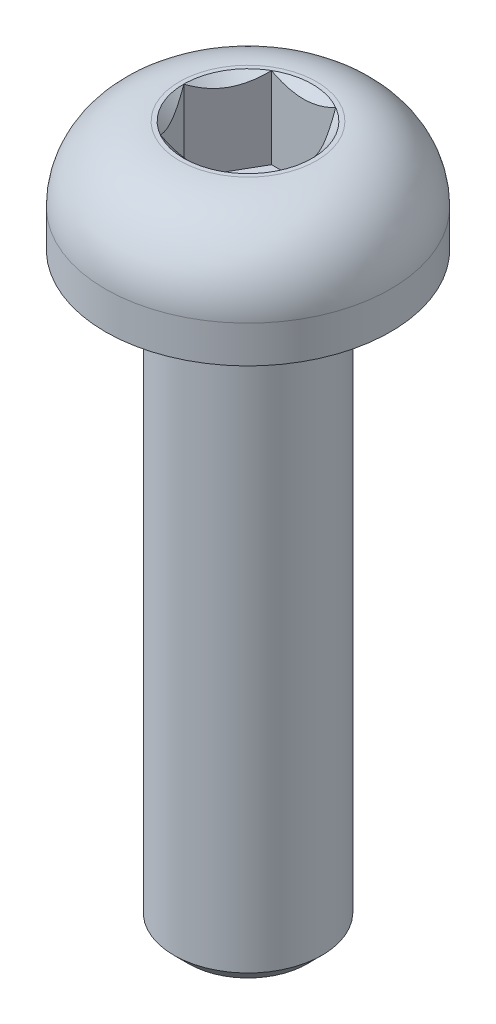
ISO-10303-21;
HEADER;
FILE_DESCRIPTION(('STEP AP214'),'2;1');
FILE_NAME('part.step','',(''),(''),'','','');
FILE_SCHEMA(('AUTOMOTIVE_DESIGN { 1 0 10303 214 1 1 1 1 }'));
ENDSEC;
DATA;
#1=APPLICATION_CONTEXT('core data for automotive mechanical design processes');
#2=APPLICATION_PROTOCOL_DEFINITION('international standard','automotive_design',2000,#1);
#3=PRODUCT_CONTEXT('',#1,'mechanical');
#4=PRODUCT('Part','Part','',(#3));
#5=PRODUCT_RELATED_PRODUCT_CATEGORY('part','',(#4));
#6=PRODUCT_DEFINITION_FORMATION('','',#4);
#7=PRODUCT_DEFINITION_CONTEXT('part definition',#1,'design');
#8=PRODUCT_DEFINITION('design','',#6,#7);
#9=PRODUCT_DEFINITION_SHAPE('','',#8);
#10=(LENGTH_UNIT() NAMED_UNIT(*) SI_UNIT(.MILLI.,.METRE.));
#11=(NAMED_UNIT(*) PLANE_ANGLE_UNIT() SI_UNIT($,.RADIAN.));
#12=(NAMED_UNIT(*) SI_UNIT($,.STERADIAN.) SOLID_ANGLE_UNIT());
#13=UNCERTAINTY_MEASURE_WITH_UNIT(LENGTH_MEASURE(1.E-05),#10,'distance_accuracy_value','');
#14=(GEOMETRIC_REPRESENTATION_CONTEXT(3) GLOBAL_UNCERTAINTY_ASSIGNED_CONTEXT((#13)) GLOBAL_UNIT_ASSIGNED_CONTEXT((#10,
#11,#12)) REPRESENTATION_CONTEXT('',''));
#15=CARTESIAN_POINT('',(0.,0.,0.));
#16=DIRECTION('',(0.,0.,1.));
#17=DIRECTION('',(1.,0.,0.));
#18=AXIS2_PLACEMENT_3D('',#15,#16,#17);
#19=CARTESIAN_POINT('',(0.,1.5,0.));
#20=DIRECTION('',(0.,1.,0.));
#21=DIRECTION('',(0.,0.,1.));
#22=AXIS2_PLACEMENT_3D('',#19,#20,#21);
#23=CONICAL_SURFACE('',#22,0.8675,0.785398163397447);
#24=CARTESIAN_POINT('',(-0.904257203356344,1.80731108686539,0.75));
#25=CARTESIAN_POINT('',(-0.882412754882664,1.79049979910954,0.75));
#26=CARTESIAN_POINT('',(-0.860451107500837,1.77384125033269,0.75));
#27=CARTESIAN_POINT('',(-0.816244486084032,1.74089387022514,0.75));
#28=CARTESIAN_POINT('',(-0.793999446840781,1.72460512647585,0.75));
#29=CARTESIAN_POINT('',(-0.72644041609512,1.67615733343807,0.75));
#30=CARTESIAN_POINT('',(-0.680633506413183,1.64467463278481,0.75));
#31=CARTESIAN_POINT('',(-0.584305204334506,1.58248336485275,0.75));
#32=CARTESIAN_POINT('',(-0.533669074640383,1.55195058649996,0.75));
#33=CARTESIAN_POINT('',(-0.42982179281195,1.49583225025063,0.75));
#34=CARTESIAN_POINT('',(-0.376620129723797,1.47022998377489,0.75));
#35=CARTESIAN_POINT('',(-0.297133733137049,1.43889962113901,0.75));
#36=CARTESIAN_POINT('',(-0.272118020151624,1.42998013178715,0.75));
#37=CARTESIAN_POINT('',(-0.221461613995012,1.41414014673559,0.75));
#38=CARTESIAN_POINT('',(-0.195820881172346,1.40721977822058,0.75));
#39=CARTESIAN_POINT('',(-0.11907719555794,1.39029491353452,0.75));
#40=CARTESIAN_POINT('',(-0.0671369524161806,1.38369713453022,0.75));
#41=CARTESIAN_POINT('',(0.0346954769499289,1.38165186600552,0.75));
#42=CARTESIAN_POINT('',(0.0845776810804191,1.38572847067954,0.75));
#43=CARTESIAN_POINT('',(0.158553806983134,1.39867277619897,0.75));
#44=CARTESIAN_POINT('',(0.183299969448745,1.40421127142444,0.75));
#45=CARTESIAN_POINT('',(0.2322573109883,1.41728731594566,0.75));
#46=CARTESIAN_POINT('',(0.256468520143736,1.42482475252543,0.75));
#47=CARTESIAN_POINT('',(0.330945548164446,1.45089644122846,0.75));
#48=CARTESIAN_POINT('',(0.380191097628157,1.47232740617748,0.75));
#49=CARTESIAN_POINT('',(0.476384677382066,1.52001795957995,0.75));
#50=CARTESIAN_POINT('',(0.523323854348435,1.54629455464135,0.75));
#51=CARTESIAN_POINT('',(0.613051165606588,1.6005514563587,0.75));
#52=CARTESIAN_POINT('',(0.655929862931857,1.62838392150654,0.75));
#53=CARTESIAN_POINT('',(0.719102713352825,1.67143006191857,0.75));
#54=CARTESIAN_POINT('',(0.739888629425195,1.68593448465665,0.75));
#55=CARTESIAN_POINT('',(0.781175323237965,1.71533224663196,0.75));
#56=CARTESIAN_POINT('',(0.801676177588826,1.73022547815469,0.75));
#57=CARTESIAN_POINT('',(0.822058112601665,1.74528009529925,0.75));
#58=B_SPLINE_CURVE_WITH_KNOTS('',3,(#24,#25,#26,#27,#28,#29,#30,#31,#32,#33,#34,#35,#36,#37,#38,
#39,#40,#41,#42,#43,#44,#45,#46,#47,#48,#49,#50,#51,#52,#53,#54,#55,#56,#57),.UNSPECIFIED.,.F.,
.F.,(4,2,2,2,2,2,2,2,2,2,2,2,2,2,2,2,4),(0.,0.0826914229952003,0.165402229814626,
0.332081999269817,0.509334939536265,0.685976204286452,0.765577633128521,0.845184125124187,
1.00113218157557,1.15024704962126,1.22624853107426,1.30224572787936,1.46290132447987,
1.62413188955184,1.7774144062988,1.85345016985303,1.92946508764175),.UNSPECIFIED.);
#59=CARTESIAN_POINT('',(0.433012701892219,1.49852540378444,0.75));
#60=VERTEX_POINT('',#59);
#61=CARTESIAN_POINT('',(-0.433012701892219,1.49852540378444,0.75));
#62=VERTEX_POINT('',#61);
#63=EDGE_CURVE('E151',#60,#62,#58,.F.);
#64=ORIENTED_EDGE('',*,*,#63,.T.);
#65=CARTESIAN_POINT('',(-0.432897231838381,1.49864089692921,0.7502));
#66=CARTESIAN_POINT('',(-0.447787073663449,1.48375951424836,0.724410037442318));
#67=CARTESIAN_POINT('',(-0.462925913388238,1.46975166939139,0.698188797871341));
#68=CARTESIAN_POINT('',(-0.493795969782309,1.4441029284667,0.644720291764294));
#69=CARTESIAN_POINT('',(-0.509530126716838,1.4324763154901,0.617467932539428));
#70=CARTESIAN_POINT('',(-0.541257419404004,1.41255944955668,0.562514649618648));
#71=CARTESIAN_POINT('',(-0.55724246221751,1.40421909786581,0.534827743304492));
#72=CARTESIAN_POINT('',(-0.589564457733289,1.39136814574586,0.478844404869148));
#73=CARTESIAN_POINT('',(-0.605900421776115,1.38684794437327,0.450549685156356));
#74=CARTESIAN_POINT('',(-0.634052006136182,1.38277123688187,0.401789710731158));
#75=CARTESIAN_POINT('',(-0.645830977225007,1.38216820039852,0.381387934344429));
#76=CARTESIAN_POINT('',(-0.66936612345897,1.38317990979996,0.340623865303642));
#77=CARTESIAN_POINT('',(-0.681122293004409,1.38479514477447,0.320261582348547));
#78=CARTESIAN_POINT('',(-0.716222952390205,1.39286155075748,0.259465456913179));
#79=CARTESIAN_POINT('',(-0.739392776123958,1.40253433961216,0.219334145003904));
#80=CARTESIAN_POINT('',(-0.780063953349298,1.42588172175675,0.148889599645977));
#81=CARTESIAN_POINT('',(-0.797755796753171,1.43833396185669,0.118246427990916));
#82=CARTESIAN_POINT('',(-0.832446334428588,1.4663850140153,0.058160654195211));
#83=CARTESIAN_POINT('',(-0.849447072771901,1.48197358968819,0.0287145116184093));
#84=CARTESIAN_POINT('',(-0.866140873838277,1.49864089692921,-0.000200000000000535));
#85=B_SPLINE_CURVE_WITH_KNOTS('',3,(#65,#66,#67,#68,#69,#70,#71,#72,#73,#74,#75,#76,#77,#78,#79,
#80,#81,#82,#83,#84),.UNSPECIFIED.,.F.,.F.,(4,2,2,2,2,2,2,2,2,4),(0.,0.099941946609559,
0.200466857654445,0.299393763705716,0.398071297300228,0.468665775681745,0.539275821398836,
0.680536257244562,0.792918418368072,0.904939568716033),.UNSPECIFIED.);
#86=CARTESIAN_POINT('',(-0.866025403784439,1.49852540378444,0.));
#87=VERTEX_POINT('',#86);
#88=EDGE_CURVE('E11',#62,#87,#85,.T.);
#89=ORIENTED_EDGE('',*,*,#88,.T.);
#90=CARTESIAN_POINT('',(-0.866140873838277,1.49864089692921,0.000199999999999512));
#91=CARTESIAN_POINT('',(-0.851251032013209,1.48375951424836,-0.0255899625576818));
#92=CARTESIAN_POINT('',(-0.836112192288419,1.4697516693914,-0.0518112021286593));
#93=CARTESIAN_POINT('',(-0.805242135894349,1.4441029284667,-0.105279708235706));
#94=CARTESIAN_POINT('',(-0.78950797895982,1.43247631549011,-0.132532067460572));
#95=CARTESIAN_POINT('',(-0.757780686272654,1.41255944955668,-0.187485350381352));
#96=CARTESIAN_POINT('',(-0.741795643459148,1.40421909786581,-0.215172256695509));
#97=CARTESIAN_POINT('',(-0.709473647943368,1.39136814574586,-0.271155595130852));
#98=CARTESIAN_POINT('',(-0.693137683900543,1.38684794437328,-0.299450314843644));
#99=CARTESIAN_POINT('',(-0.664986099540476,1.38277123688187,-0.348210289268842));
#100=CARTESIAN_POINT('',(-0.653207128451651,1.38216820039852,-0.368612065655571));
#101=CARTESIAN_POINT('',(-0.629671982217688,1.38317990979996,-0.409376134696358));
#102=CARTESIAN_POINT('',(-0.617915812672249,1.38479514477447,-0.429738417651453));
#103=CARTESIAN_POINT('',(-0.582815153286453,1.39286155075748,-0.490534543086821));
#104=CARTESIAN_POINT('',(-0.5596453295527,1.40253433961216,-0.530665854996096));
#105=CARTESIAN_POINT('',(-0.51897415232736,1.42588172175675,-0.601110400354023));
#106=CARTESIAN_POINT('',(-0.501282308923486,1.43833396185669,-0.631753572009084));
#107=CARTESIAN_POINT('',(-0.466591771248069,1.4663850140153,-0.691839345804789));
#108=CARTESIAN_POINT('',(-0.449591032904757,1.48197358968819,-0.721285488381591));
#109=CARTESIAN_POINT('',(-0.432897231838381,1.49864089692921,-0.7502));
#110=B_SPLINE_CURVE_WITH_KNOTS('',3,(#90,#91,#92,#93,#94,#95,#96,#97,#98,#99,#100,#101,#102,
#103,#104,#105,#106,#107,#108,#109),.UNSPECIFIED.,.F.,.F.,(4,2,2,2,2,2,2,2,2,4),(0.,
0.0999419466095591,0.200466857654445,0.299393763705716,0.398071297300228,0.468665775681745,
0.539275821398836,0.680536257244562,0.792918418368072,0.904939568716032),.UNSPECIFIED.);
#111=CARTESIAN_POINT('',(-0.433012701892219,1.49852540378444,-0.75));
#112=VERTEX_POINT('',#111);
#113=EDGE_CURVE('E44',#87,#112,#110,.T.);
#114=ORIENTED_EDGE('',*,*,#113,.T.);
#115=CARTESIAN_POINT('',(-0.904257203356344,1.80731108686539,-0.75));
#116=CARTESIAN_POINT('',(-0.882412754882664,1.79049979910954,-0.75));
#117=CARTESIAN_POINT('',(-0.860451107500837,1.77384125033269,-0.75));
#118=CARTESIAN_POINT('',(-0.816244486084032,1.74089387022514,-0.75));
#119=CARTESIAN_POINT('',(-0.793999446840781,1.72460512647585,-0.75));
#120=CARTESIAN_POINT('',(-0.72644041609512,1.67615733343807,-0.75));
#121=CARTESIAN_POINT('',(-0.680633506413183,1.64467463278481,-0.75));
#122=CARTESIAN_POINT('',(-0.584305204334507,1.58248336485275,-0.75));
#123=CARTESIAN_POINT('',(-0.533669074640383,1.55195058649996,-0.75));
#124=CARTESIAN_POINT('',(-0.42982179281195,1.49583225025063,-0.75));
#125=CARTESIAN_POINT('',(-0.376620129723798,1.47022998377489,-0.75));
#126=CARTESIAN_POINT('',(-0.297133733137049,1.43889962113901,-0.75));
#127=CARTESIAN_POINT('',(-0.272118020151624,1.42998013178715,-0.75));
#128=CARTESIAN_POINT('',(-0.221461613995012,1.41414014673559,-0.75));
#129=CARTESIAN_POINT('',(-0.195820881172346,1.40721977822059,-0.75));
#130=CARTESIAN_POINT('',(-0.11907719555794,1.39029491353453,-0.75));
#131=CARTESIAN_POINT('',(-0.0671369524161803,1.38369713453023,-0.75));
#132=CARTESIAN_POINT('',(0.0346954769499294,1.38165186600552,-0.75));
#133=CARTESIAN_POINT('',(0.0845776810804197,1.38572847067954,-0.75));
#134=CARTESIAN_POINT('',(0.158553806983135,1.39867277619897,-0.75));
#135=CARTESIAN_POINT('',(0.183299969448746,1.40421127142444,-0.75));
#136=CARTESIAN_POINT('',(0.2322573109883,1.41728731594566,-0.75));
#137=CARTESIAN_POINT('',(0.256468520143736,1.42482475252543,-0.75));
#138=CARTESIAN_POINT('',(0.330945548164446,1.45089644122846,-0.75));
#139=CARTESIAN_POINT('',(0.380191097628158,1.47232740617748,-0.75));
#140=CARTESIAN_POINT('',(0.476384677382067,1.52001795957995,-0.75));
#141=CARTESIAN_POINT('',(0.523323854348436,1.54629455464135,-0.75));
#142=CARTESIAN_POINT('',(0.613051165606589,1.6005514563587,-0.75));
#143=CARTESIAN_POINT('',(0.655929862931858,1.62838392150654,-0.75));
#144=CARTESIAN_POINT('',(0.719102713352826,1.67143006191857,-0.75));
#145=CARTESIAN_POINT('',(0.739888629425196,1.68593448465665,-0.75));
#146=CARTESIAN_POINT('',(0.781175323237966,1.71533224663196,-0.75));
#147=CARTESIAN_POINT('',(0.801676177588827,1.73022547815469,-0.75));
#148=CARTESIAN_POINT('',(0.822058112601667,1.74528009529925,-0.75));
#149=B_SPLINE_CURVE_WITH_KNOTS('',3,(#115,#116,#117,#118,#119,#120,#121,#122,#123,#124,#125,
#126,#127,#128,#129,#130,#131,#132,#133,#134,#135,#136,#137,#138,#139,#140,#141,#142,#143,#144,
#145,#146,#147,#148),.UNSPECIFIED.,.F.,.F.,(4,2,2,2,2,2,2,2,2,2,2,2,2,2,2,2,4),(0.,
0.0826914229952003,0.165402229814626,0.332081999269816,0.509334939536264,0.685976204286451,
0.76557763312852,0.845184125124187,1.00113218157557,1.15024704962126,1.22624853107426,
1.30224572787936,1.46290132447987,1.62413188955185,1.7774144062988,1.85345016985303,
1.92946508764176),.UNSPECIFIED.);
#150=CARTESIAN_POINT('',(0.433012701892219,1.49852540378444,-0.75));
#151=VERTEX_POINT('',#150);
#152=EDGE_CURVE('E182',#112,#151,#149,.T.);
#153=ORIENTED_EDGE('',*,*,#152,.T.);
#154=CARTESIAN_POINT('',(0.432897231838381,1.49864089692921,-0.7502));
#155=CARTESIAN_POINT('',(0.447787073663449,1.48375951424836,-0.724410037442319));
#156=CARTESIAN_POINT('',(0.462925913388238,1.4697516693914,-0.698188797871341));
#157=CARTESIAN_POINT('',(0.493795969782309,1.4441029284667,-0.644720291764295));
#158=CARTESIAN_POINT('',(0.509530126716838,1.43247631549011,-0.617467932539429));
#159=CARTESIAN_POINT('',(0.541257419404004,1.41255944955668,-0.562514649618649));
#160=CARTESIAN_POINT('',(0.55724246221751,1.40421909786581,-0.534827743304492));
#161=CARTESIAN_POINT('',(0.589564457733289,1.39136814574586,-0.478844404869149));
#162=CARTESIAN_POINT('',(0.605900421776115,1.38684794437327,-0.450549685156357));
#163=CARTESIAN_POINT('',(0.634052006136182,1.38277123688187,-0.401789710731159));
#164=CARTESIAN_POINT('',(0.645830977225007,1.38216820039852,-0.38138793434443));
#165=CARTESIAN_POINT('',(0.66936612345897,1.38317990979996,-0.340623865303643));
#166=CARTESIAN_POINT('',(0.681122293004409,1.38479514477447,-0.320261582348548));
#167=CARTESIAN_POINT('',(0.716222952390205,1.39286155075748,-0.25946545691318));
#168=CARTESIAN_POINT('',(0.739392776123958,1.40253433961216,-0.219334145003905));
#169=CARTESIAN_POINT('',(0.780063953349298,1.42588172175675,-0.148889599645978));
#170=CARTESIAN_POINT('',(0.797755796753172,1.43833396185669,-0.118246427990917));
#171=CARTESIAN_POINT('',(0.832446334428589,1.4663850140153,-0.058160654195212));
#172=CARTESIAN_POINT('',(0.849447072771901,1.48197358968819,-0.0287145116184104));
#173=CARTESIAN_POINT('',(0.866140873838277,1.49864089692921,0.000199999999999531));
#174=B_SPLINE_CURVE_WITH_KNOTS('',3,(#154,#155,#156,#157,#158,#159,#160,#161,#162,#163,#164,
#165,#166,#167,#168,#169,#170,#171,#172,#173),.UNSPECIFIED.,.F.,.F.,(4,2,2,2,2,2,2,2,2,4),(0.,
0.0999419466095591,0.200466857654445,0.299393763705716,0.398071297300228,0.468665775681745,
0.539275821398836,0.680536257244562,0.792918418368072,0.904939568716032),.UNSPECIFIED.);
#175=CARTESIAN_POINT('',(0.866025403784439,1.49852540378444,0.));
#176=VERTEX_POINT('',#175);
#177=EDGE_CURVE('E176',#151,#176,#174,.T.);
#178=ORIENTED_EDGE('',*,*,#177,.T.);
#179=CARTESIAN_POINT('',(0.866140873838277,1.49864089692921,-0.000200000000000354));
#180=CARTESIAN_POINT('',(0.851251032013209,1.48375951424836,0.025589962557681));
#181=CARTESIAN_POINT('',(0.836112192288419,1.4697516693914,0.0518112021286585));
#182=CARTESIAN_POINT('',(0.805242135894349,1.4441029284667,0.105279708235705));
#183=CARTESIAN_POINT('',(0.78950797895982,1.4324763154901,0.132532067460572));
#184=CARTESIAN_POINT('',(0.757780686272654,1.41255944955668,0.187485350381352));
#185=CARTESIAN_POINT('',(0.741795643459148,1.40421909786581,0.215172256695508));
#186=CARTESIAN_POINT('',(0.709473647943368,1.39136814574586,0.271155595130852));
#187=CARTESIAN_POINT('',(0.693137683900543,1.38684794437327,0.299450314843644));
#188=CARTESIAN_POINT('',(0.664986099540475,1.38277123688187,0.348210289268842));
#189=CARTESIAN_POINT('',(0.653207128451651,1.38216820039852,0.368612065655571));
#190=CARTESIAN_POINT('',(0.629671982217688,1.38317990979996,0.409376134696358));
#191=CARTESIAN_POINT('',(0.617915812672248,1.38479514477447,0.429738417651453));
#192=CARTESIAN_POINT('',(0.582815153286452,1.39286155075748,0.490534543086821));
#193=CARTESIAN_POINT('',(0.5596453295527,1.40253433961216,0.530665854996096));
#194=CARTESIAN_POINT('',(0.51897415232736,1.42588172175675,0.601110400354023));
#195=CARTESIAN_POINT('',(0.501282308923486,1.43833396185669,0.631753572009084));
#196=CARTESIAN_POINT('',(0.466591771248069,1.4663850140153,0.691839345804788));
#197=CARTESIAN_POINT('',(0.449591032904757,1.48197358968819,0.72128548838159));
#198=CARTESIAN_POINT('',(0.432897231838381,1.49864089692921,0.7502));
#199=B_SPLINE_CURVE_WITH_KNOTS('',3,(#179,#180,#181,#182,#183,#184,#185,#186,#187,#188,#189,
#190,#191,#192,#193,#194,#195,#196,#197,#198),.UNSPECIFIED.,.F.,.F.,(4,2,2,2,2,2,2,2,2,4),(0.,
0.0999419466095594,0.200466857654446,0.299393763705717,0.398071297300229,0.468665775681746,
0.539275821398837,0.680536257244563,0.792918418368072,0.904939568716032),.UNSPECIFIED.);
#200=EDGE_CURVE('E157',#176,#60,#199,.T.);
#201=ORIENTED_EDGE('',*,*,#200,.T.);
#202=EDGE_LOOP('',(#64,#89,#114,#153,#178,#201));
#203=FACE_BOUND('',#202,.T.);
#204=CARTESIAN_POINT('',(0.,1.5,0.));
#205=DIRECTION('',(0.,1.,0.));
#206=DIRECTION('',(0.,0.,1.));
#207=AXIS2_PLACEMENT_3D('',#204,#205,#206);
#208=CIRCLE('',#207,0.8675);
#209=CARTESIAN_POINT('',(0.,1.5,0.8675));
#210=VERTEX_POINT('',#209);
#211=EDGE_CURVE('E148',#210,#210,#208,.T.);
#212=ORIENTED_EDGE('',*,*,#211,.T.);
#213=EDGE_LOOP('',(#212));
#214=FACE_BOUND('',#213,.T.);
#215=ADVANCED_FACE('F35',(#203,#214),#23,.F.);
#216=CARTESIAN_POINT('',(0.,1.5,-0.925));
#217=DIRECTION('',(0.,-1.,0.));
#218=DIRECTION('',(0.,0.,-1.));
#219=AXIS2_PLACEMENT_3D('',#216,#217,#218);
#220=PLANE('',#219);
#221=ORIENTED_EDGE('',*,*,#211,.F.);
#222=EDGE_LOOP('',(#221));
#223=FACE_BOUND('',#222,.T.);
#224=CARTESIAN_POINT('',(0.,1.5,0.));
#225=DIRECTION('',(0.,1.,0.));
#226=DIRECTION('',(0.,0.,1.));
#227=AXIS2_PLACEMENT_3D('',#224,#225,#226);
#228=CIRCLE('',#227,0.925000000000001);
#229=CARTESIAN_POINT('',(0.,1.5,0.925000000000001));
#230=VERTEX_POINT('',#229);
#231=EDGE_CURVE('E145',#230,#230,#228,.T.);
#232=ORIENTED_EDGE('',*,*,#231,.T.);
#233=EDGE_LOOP('',(#232));
#234=FACE_BOUND('',#233,.T.);
#235=ADVANCED_FACE('F168',(#223,#234),#220,.F.);
#236=CARTESIAN_POINT('',(0.,0.5,0.));
#237=DIRECTION('',(0.,1.,0.));
#238=DIRECTION('',(0.,0.,1.));
#239=AXIS2_PLACEMENT_3D('',#236,#237,#238);
#240=DEGENERATE_TOROIDAL_SURFACE('',#239,0.925,1.,.T.);
#241=ORIENTED_EDGE('',*,*,#231,.F.);
#242=EDGE_LOOP('',(#241));
#243=FACE_BOUND('',#242,.T.);
#244=CARTESIAN_POINT('',(0.,0.5,0.));
#245=DIRECTION('',(0.,1.,0.));
#246=DIRECTION('',(0.,0.,1.));
#247=AXIS2_PLACEMENT_3D('',#244,#245,#246);
#248=CIRCLE('',#247,1.925);
#249=CARTESIAN_POINT('',(0.,0.5,1.925));
#250=VERTEX_POINT('',#249);
#251=EDGE_CURVE('E142',#250,#250,#248,.T.);
#252=ORIENTED_EDGE('',*,*,#251,.T.);
#253=EDGE_LOOP('',(#252));
#254=FACE_BOUND('',#253,.T.);
#255=ADVANCED_FACE('F230',(#243,#254),#240,.T.);
#256=CARTESIAN_POINT('',(0.,2.83766527063465,0.));
#257=DIRECTION('',(0.,1.,0.));
#258=DIRECTION('',(0.,0.,1.));
#259=AXIS2_PLACEMENT_3D('',#256,#257,#258);
#260=CYLINDRICAL_SURFACE('',#259,1.925);
#261=ORIENTED_EDGE('',*,*,#251,.F.);
#262=EDGE_LOOP('',(#261));
#263=FACE_BOUND('',#262,.T.);
#264=CARTESIAN_POINT('',(0.,0.,0.));
#265=DIRECTION('',(0.,1.,0.));
#266=DIRECTION('',(0.,0.,1.));
#267=AXIS2_PLACEMENT_3D('',#264,#265,#266);
#268=CIRCLE('',#267,1.925);
#269=CARTESIAN_POINT('',(0.,0.,1.925));
#270=VERTEX_POINT('',#269);
#271=EDGE_CURVE('E139',#270,#270,#268,.T.);
#272=ORIENTED_EDGE('',*,*,#271,.T.);
#273=EDGE_LOOP('',(#272));
#274=FACE_BOUND('',#273,.T.);
#275=ADVANCED_FACE('F235',(#263,#274),#260,.T.);
#276=CARTESIAN_POINT('',(0.,0.,-1.15));
#277=DIRECTION('',(0.,1.,0.));
#278=DIRECTION('',(0.,0.,1.));
#279=AXIS2_PLACEMENT_3D('',#276,#277,#278);
#280=PLANE('',#279);
#281=ORIENTED_EDGE('',*,*,#271,.F.);
#282=EDGE_LOOP('',(#281));
#283=FACE_BOUND('',#282,.T.);
#284=CARTESIAN_POINT('',(0.,0.,0.));
#285=DIRECTION('',(0.,1.,0.));
#286=DIRECTION('',(0.,0.,1.));
#287=AXIS2_PLACEMENT_3D('',#284,#285,#286);
#288=CIRCLE('',#287,1.15);
#289=CARTESIAN_POINT('',(0.,0.,1.15));
#290=VERTEX_POINT('',#289);
#291=EDGE_CURVE('E136',#290,#290,#288,.T.);
#292=ORIENTED_EDGE('',*,*,#291,.T.);
#293=EDGE_LOOP('',(#292));
#294=FACE_BOUND('',#293,.T.);
#295=ADVANCED_FACE('F240',(#283,#294),#280,.F.);
#296=CARTESIAN_POINT('',(0.,-0.15,0.));
#297=DIRECTION('',(0.,1.,0.));
#298=DIRECTION('',(0.,0.,1.));
#299=AXIS2_PLACEMENT_3D('',#296,#297,#298);
#300=TOROIDAL_SURFACE('',#299,1.15,0.15);
#301=ORIENTED_EDGE('',*,*,#291,.F.);
#302=EDGE_LOOP('',(#301));
#303=FACE_BOUND('',#302,.T.);
#304=CARTESIAN_POINT('',(0.,-0.15,0.));
#305=DIRECTION('',(0.,1.,0.));
#306=DIRECTION('',(0.,0.,1.));
#307=AXIS2_PLACEMENT_3D('',#304,#305,#306);
#308=CIRCLE('',#307,1.);
#309=CARTESIAN_POINT('',(0.,-0.15,1.));
#310=VERTEX_POINT('',#309);
#311=EDGE_CURVE('E133',#310,#310,#308,.T.);
#312=ORIENTED_EDGE('',*,*,#311,.T.);
#313=EDGE_LOOP('',(#312));
#314=FACE_BOUND('',#313,.T.);
#315=ADVANCED_FACE('F246',(#303,#314),#300,.F.);
#316=CARTESIAN_POINT('',(0.,2.83766527063465,0.));
#317=DIRECTION('',(0.,1.,0.));
#318=DIRECTION('',(0.,0.,1.));
#319=AXIS2_PLACEMENT_3D('',#316,#317,#318);
#320=CYLINDRICAL_SURFACE('',#319,1.);
#321=ORIENTED_EDGE('',*,*,#311,.F.);
#322=EDGE_LOOP('',(#321));
#323=FACE_BOUND('',#322,.T.);
#324=CARTESIAN_POINT('',(0.,-7.75,0.));
#325=DIRECTION('',(0.,1.,0.));
#326=DIRECTION('',(0.,0.,1.));
#327=AXIS2_PLACEMENT_3D('',#324,#325,#326);
#328=CIRCLE('',#327,1.);
#329=CARTESIAN_POINT('',(0.,-7.75,1.));
#330=VERTEX_POINT('',#329);
#331=EDGE_CURVE('E130',#330,#330,#328,.T.);
#332=ORIENTED_EDGE('',*,*,#331,.T.);
#333=EDGE_LOOP('',(#332));
#334=FACE_BOUND('',#333,.T.);
#335=ADVANCED_FACE('F252',(#323,#334),#320,.T.);
#336=CARTESIAN_POINT('',(0.,-7.95,0.));
#337=DIRECTION('',(0.,1.,0.));
#338=DIRECTION('',(0.,0.,1.));
#339=AXIS2_PLACEMENT_3D('',#336,#337,#338);
#340=CONICAL_SURFACE('',#339,0.800000000000001,0.785398163397453);
#341=ORIENTED_EDGE('',*,*,#331,.F.);
#342=EDGE_LOOP('',(#341));
#343=FACE_BOUND('',#342,.T.);
#344=CARTESIAN_POINT('',(0.,-7.95,0.));
#345=DIRECTION('',(0.,1.,0.));
#346=DIRECTION('',(0.,0.,1.));
#347=AXIS2_PLACEMENT_3D('',#344,#345,#346);
#348=CIRCLE('',#347,0.800000000000001);
#349=CARTESIAN_POINT('',(0.,-7.95,0.800000000000001));
#350=VERTEX_POINT('',#349);
#351=EDGE_CURVE('E127',#350,#350,#348,.T.);
#352=ORIENTED_EDGE('',*,*,#351,.T.);
#353=EDGE_LOOP('',(#352));
#354=FACE_BOUND('',#353,.T.);
#355=ADVANCED_FACE('F258',(#343,#354),#340,.T.);
#356=CARTESIAN_POINT('',(0.,-7.95,0.));
#357=DIRECTION('',(0.,1.,0.));
#358=DIRECTION('',(0.,0.,1.));
#359=AXIS2_PLACEMENT_3D('',#356,#357,#358);
#360=PLANE('',#359);
#361=ORIENTED_EDGE('',*,*,#351,.F.);
#362=EDGE_LOOP('',(#361));
#363=FACE_BOUND('',#362,.T.);
#364=ADVANCED_FACE('F264',(#363),#360,.F.);
#365=CARTESIAN_POINT('',(0.,0.4,0.));
#366=DIRECTION('',(0.,1.,0.));
#367=DIRECTION('',(0.,0.,1.));
#368=AXIS2_PLACEMENT_3D('',#365,#366,#367);
#369=PLANE('',#368);
#370=DIRECTION('',(0.5,0.,0.866025403784439));
#371=VECTOR('',#370,1.);
#372=CARTESIAN_POINT('',(-0.649519052838329,0.4,0.375));
#373=LINE('',#372,#371);
#374=CARTESIAN_POINT('',(-0.866025403784439,0.4,0.));
#375=VERTEX_POINT('',#374);
#376=CARTESIAN_POINT('',(-0.433012701892219,0.4,0.75));
#377=VERTEX_POINT('',#376);
#378=EDGE_CURVE('E91',#375,#377,#373,.T.);
#379=ORIENTED_EDGE('',*,*,#378,.T.);
#380=DIRECTION('',(1.,0.,0.));
#381=VECTOR('',#380,1.);
#382=CARTESIAN_POINT('',(0.,0.4,0.75));
#383=LINE('',#382,#381);
#384=CARTESIAN_POINT('',(0.433012701892219,0.4,0.75));
#385=VERTEX_POINT('',#384);
#386=EDGE_CURVE('E98',#377,#385,#383,.T.);
#387=ORIENTED_EDGE('',*,*,#386,.T.);
#388=DIRECTION('',(0.5,0.,-0.866025403784439));
#389=VECTOR('',#388,1.);
#390=CARTESIAN_POINT('',(0.649519052838329,0.4,0.375));
#391=LINE('',#390,#389);
#392=CARTESIAN_POINT('',(0.866025403784439,0.4,0.));
#393=VERTEX_POINT('',#392);
#394=EDGE_CURVE('E103',#385,#393,#391,.T.);
#395=ORIENTED_EDGE('',*,*,#394,.T.);
#396=DIRECTION('',(-0.5,0.,-0.866025403784438));
#397=VECTOR('',#396,1.);
#398=CARTESIAN_POINT('',(0.649519052838329,0.4,-0.375));
#399=LINE('',#398,#397);
#400=CARTESIAN_POINT('',(0.433012701892219,0.4,-0.75));
#401=VERTEX_POINT('',#400);
#402=EDGE_CURVE('E112',#393,#401,#399,.T.);
#403=ORIENTED_EDGE('',*,*,#402,.T.);
#404=DIRECTION('',(-1.,0.,0.));
#405=VECTOR('',#404,1.);
#406=CARTESIAN_POINT('',(0.,0.4,-0.75));
#407=LINE('',#406,#405);
#408=CARTESIAN_POINT('',(-0.433012701892219,0.4,-0.75));
#409=VERTEX_POINT('',#408);
#410=EDGE_CURVE('E115',#401,#409,#407,.T.);
#411=ORIENTED_EDGE('',*,*,#410,.T.);
#412=DIRECTION('',(-0.5,0.,0.866025403784439));
#413=VECTOR('',#412,1.);
#414=CARTESIAN_POINT('',(-0.649519052838329,0.4,-0.375));
#415=LINE('',#414,#413);
#416=EDGE_CURVE('E95',#409,#375,#415,.T.);
#417=ORIENTED_EDGE('',*,*,#416,.T.);
#418=EDGE_LOOP('',(#379,#387,#395,#403,#411,#417));
#419=FACE_BOUND('',#418,.T.);
#420=CARTESIAN_POINT('',(0.,0.4,0.));
#421=DIRECTION('',(0.,1.,0.));
#422=DIRECTION('',(0.,0.,1.));
#423=AXIS2_PLACEMENT_3D('',#420,#421,#422);
#424=CIRCLE('',#423,0.0689007276186764);
#425=CARTESIAN_POINT('',(0.,0.4,0.0689007276186764));
#426=VERTEX_POINT('',#425);
#427=EDGE_CURVE('E39',#426,#426,#424,.F.);
#428=ORIENTED_EDGE('',*,*,#427,.T.);
#429=EDGE_LOOP('',(#428));
#430=FACE_BOUND('',#429,.T.);
#431=ADVANCED_FACE('F105',(#419,#430),#369,.T.);
#432=CARTESIAN_POINT('',(-0.649519052838329,0.4,0.375));
#433=DIRECTION('',(-0.866025403784438,0.,0.5));
#434=DIRECTION('',(0.5,0.,0.866025403784439));
#435=AXIS2_PLACEMENT_3D('',#432,#433,#434);
#436=PLANE('',#435);
#437=DIRECTION('',(0.,1.,0.));
#438=VECTOR('',#437,1.);
#439=CARTESIAN_POINT('',(-0.866025403784439,0.4,0.));
#440=LINE('',#439,#438);
#441=EDGE_CURVE('E118',#375,#87,#440,.T.);
#442=ORIENTED_EDGE('',*,*,#441,.T.);
#443=ORIENTED_EDGE('',*,*,#88,.F.);
#444=DIRECTION('',(0.,1.,0.));
#445=VECTOR('',#444,1.);
#446=CARTESIAN_POINT('',(-0.433012701892219,0.4,0.75));
#447=LINE('',#446,#445);
#448=EDGE_CURVE('E51',#377,#62,#447,.T.);
#449=ORIENTED_EDGE('',*,*,#448,.F.);
#450=ORIENTED_EDGE('',*,*,#378,.F.);
#451=EDGE_LOOP('',(#442,#443,#449,#450));
#452=FACE_BOUND('',#451,.T.);
#453=ADVANCED_FACE('F89',(#452),#436,.F.);
#454=CARTESIAN_POINT('',(-0.649519052838329,0.4,-0.375));
#455=DIRECTION('',(-0.866025403784438,0.,-0.5));
#456=DIRECTION('',(-0.5,0.,0.866025403784439));
#457=AXIS2_PLACEMENT_3D('',#454,#455,#456);
#458=PLANE('',#457);
#459=DIRECTION('',(0.,1.,0.));
#460=VECTOR('',#459,1.);
#461=CARTESIAN_POINT('',(-0.433012701892219,0.4,-0.75));
#462=LINE('',#461,#460);
#463=EDGE_CURVE('E120',#409,#112,#462,.T.);
#464=ORIENTED_EDGE('',*,*,#463,.T.);
#465=ORIENTED_EDGE('',*,*,#113,.F.);
#466=ORIENTED_EDGE('',*,*,#441,.F.);
#467=ORIENTED_EDGE('',*,*,#416,.F.);
#468=EDGE_LOOP('',(#464,#465,#466,#467));
#469=FACE_BOUND('',#468,.T.);
#470=ADVANCED_FACE('F196',(#469),#458,.F.);
#471=CARTESIAN_POINT('',(0.,0.4,-0.75));
#472=DIRECTION('',(0.,0.,-1.));
#473=DIRECTION('',(-1.,0.,0.));
#474=AXIS2_PLACEMENT_3D('',#471,#472,#473);
#475=PLANE('',#474);
#476=DIRECTION('',(0.,1.,0.));
#477=VECTOR('',#476,1.);
#478=CARTESIAN_POINT('',(0.433012701892219,0.4,-0.75));
#479=LINE('',#478,#477);
#480=EDGE_CURVE('E122',#401,#151,#479,.T.);
#481=ORIENTED_EDGE('',*,*,#480,.T.);
#482=ORIENTED_EDGE('',*,*,#152,.F.);
#483=ORIENTED_EDGE('',*,*,#463,.F.);
#484=ORIENTED_EDGE('',*,*,#410,.F.);
#485=EDGE_LOOP('',(#481,#482,#483,#484));
#486=FACE_BOUND('',#485,.T.);
#487=ADVANCED_FACE('F200',(#486),#475,.F.);
#488=CARTESIAN_POINT('',(0.649519052838329,0.4,-0.375));
#489=DIRECTION('',(0.866025403784438,0.,-0.5));
#490=DIRECTION('',(-0.5,0.,-0.866025403784438));
#491=AXIS2_PLACEMENT_3D('',#488,#489,#490);
#492=PLANE('',#491);
#493=DIRECTION('',(0.,1.,0.));
#494=VECTOR('',#493,1.);
#495=CARTESIAN_POINT('',(0.866025403784439,0.4,0.));
#496=LINE('',#495,#494);
#497=EDGE_CURVE('E124',#393,#176,#496,.T.);
#498=ORIENTED_EDGE('',*,*,#497,.T.);
#499=ORIENTED_EDGE('',*,*,#177,.F.);
#500=ORIENTED_EDGE('',*,*,#480,.F.);
#501=ORIENTED_EDGE('',*,*,#402,.F.);
#502=EDGE_LOOP('',(#498,#499,#500,#501));
#503=FACE_BOUND('',#502,.T.);
#504=ADVANCED_FACE('F204',(#503),#492,.F.);
#505=CARTESIAN_POINT('',(0.649519052838329,0.4,0.375));
#506=DIRECTION('',(0.866025403784438,0.,0.5));
#507=DIRECTION('',(0.5,0.,-0.866025403784439));
#508=AXIS2_PLACEMENT_3D('',#505,#506,#507);
#509=PLANE('',#508);
#510=DIRECTION('',(0.,1.,0.));
#511=VECTOR('',#510,1.);
#512=CARTESIAN_POINT('',(0.433012701892219,0.4,0.75));
#513=LINE('',#512,#511);
#514=EDGE_CURVE('E94',#385,#60,#513,.T.);
#515=ORIENTED_EDGE('',*,*,#514,.T.);
#516=ORIENTED_EDGE('',*,*,#200,.F.);
#517=ORIENTED_EDGE('',*,*,#497,.F.);
#518=ORIENTED_EDGE('',*,*,#394,.F.);
#519=EDGE_LOOP('',(#515,#516,#517,#518));
#520=FACE_BOUND('',#519,.T.);
#521=ADVANCED_FACE('F208',(#520),#509,.F.);
#522=CARTESIAN_POINT('',(0.,0.4,0.75));
#523=DIRECTION('',(0.,0.,1.));
#524=DIRECTION('',(1.,0.,0.));
#525=AXIS2_PLACEMENT_3D('',#522,#523,#524);
#526=PLANE('',#525);
#527=ORIENTED_EDGE('',*,*,#448,.T.);
#528=ORIENTED_EDGE('',*,*,#63,.F.);
#529=ORIENTED_EDGE('',*,*,#514,.F.);
#530=ORIENTED_EDGE('',*,*,#386,.F.);
#531=EDGE_LOOP('',(#527,#528,#529,#530));
#532=FACE_BOUND('',#531,.T.);
#533=ADVANCED_FACE('F99',(#532),#526,.F.);
#534=CARTESIAN_POINT('',(0.,0.5825,0.));
#535=DIRECTION('',(0.,1.,0.));
#536=DIRECTION('',(0.,0.,1.));
#537=AXIS2_PLACEMENT_3D('',#534,#535,#536);
#538=CONICAL_SURFACE('',#537,0.75,1.30899693899575);
#539=CARTESIAN_POINT('',(0.,0.381538105676659,0.));
#540=VERTEX_POINT('',#539);
#541=VERTEX_LOOP('',#540);
#542=FACE_BOUND('',#541,.T.);
#543=ORIENTED_EDGE('',*,*,#427,.F.);
#544=EDGE_LOOP('',(#543));
#545=FACE_BOUND('',#544,.T.);
#546=ADVANCED_FACE('F37',(#542,#545),#538,.F.);
#547=CLOSED_SHELL('',(#215,#235,#255,#275,#295,#315,#335,#355,#364,#431,#453,#470,#487,#504,
#521,#533,#546));
#548=MANIFOLD_SOLID_BREP('B2',#547);
#549=ADVANCED_BREP_SHAPE_REPRESENTATION('',(#18,#548),#14);
#550=SHAPE_DEFINITION_REPRESENTATION(#9,#549);
ENDSEC;
END-ISO-10303-21;
